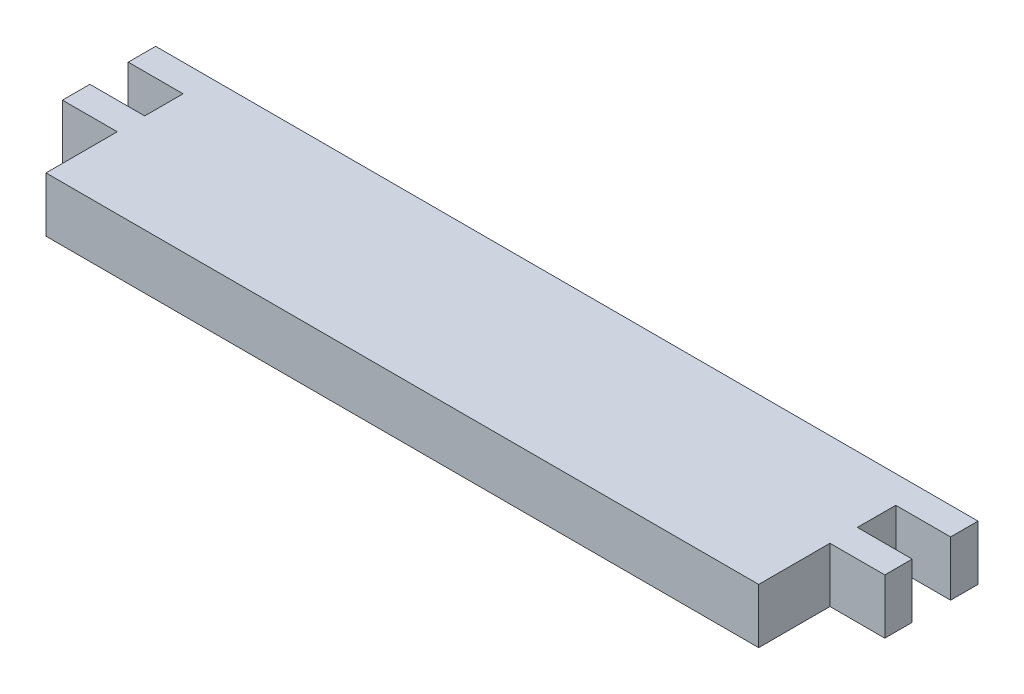
ISO-10303-21;
HEADER;
FILE_DESCRIPTION(('STEP AP214'),'2;1');
FILE_NAME('part.step','',(''),(''),'','','');
FILE_SCHEMA(('AUTOMOTIVE_DESIGN { 1 0 10303 214 1 1 1 1 }'));
ENDSEC;
DATA;
#1=APPLICATION_CONTEXT('core data for automotive mechanical design processes');
#2=APPLICATION_PROTOCOL_DEFINITION('international standard','automotive_design',2000,#1);
#3=PRODUCT_CONTEXT('',#1,'mechanical');
#4=PRODUCT('Part','Part','',(#3));
#5=PRODUCT_RELATED_PRODUCT_CATEGORY('part','',(#4));
#6=PRODUCT_DEFINITION_FORMATION('','',#4);
#7=PRODUCT_DEFINITION_CONTEXT('part definition',#1,'design');
#8=PRODUCT_DEFINITION('design','',#6,#7);
#9=PRODUCT_DEFINITION_SHAPE('','',#8);
#10=(LENGTH_UNIT() NAMED_UNIT(*) SI_UNIT(.MILLI.,.METRE.));
#11=(NAMED_UNIT(*) PLANE_ANGLE_UNIT() SI_UNIT($,.RADIAN.));
#12=(NAMED_UNIT(*) SI_UNIT($,.STERADIAN.) SOLID_ANGLE_UNIT());
#13=UNCERTAINTY_MEASURE_WITH_UNIT(LENGTH_MEASURE(1.E-05),#10,'distance_accuracy_value','');
#14=(GEOMETRIC_REPRESENTATION_CONTEXT(3) GLOBAL_UNCERTAINTY_ASSIGNED_CONTEXT((#13)) GLOBAL_UNIT_ASSIGNED_CONTEXT((#10,
#11,#12)) REPRESENTATION_CONTEXT('',''));
#15=CARTESIAN_POINT('',(0.,0.,0.));
#16=DIRECTION('',(0.,0.,1.));
#17=DIRECTION('',(1.,0.,0.));
#18=AXIS2_PLACEMENT_3D('',#15,#16,#17);
#19=CARTESIAN_POINT('',(65.,5.,7.));
#20=DIRECTION('',(-1.,0.,0.));
#21=DIRECTION('',(0.,0.,1.));
#22=AXIS2_PLACEMENT_3D('',#19,#20,#21);
#23=PLANE('',#22);
#24=DIRECTION('',(0.,0.,-1.));
#25=VECTOR('',#24,1.);
#26=CARTESIAN_POINT('',(65.,5.,7.));
#27=LINE('',#26,#25);
#28=CARTESIAN_POINT('',(65.,5.,7.));
#29=VERTEX_POINT('',#28);
#30=CARTESIAN_POINT('',(65.,5.,0.));
#31=VERTEX_POINT('',#30);
#32=EDGE_CURVE('E52',#29,#31,#27,.T.);
#33=ORIENTED_EDGE('',*,*,#32,.F.);
#34=DIRECTION('',(0.,-1.,0.));
#35=VECTOR('',#34,1.);
#36=CARTESIAN_POINT('',(65.,5.,7.));
#37=LINE('',#36,#35);
#38=CARTESIAN_POINT('',(65.,-5.,7.));
#39=VERTEX_POINT('',#38);
#40=EDGE_CURVE('E59',#29,#39,#37,.T.);
#41=ORIENTED_EDGE('',*,*,#40,.T.);
#42=DIRECTION('',(0.,0.,-1.));
#43=VECTOR('',#42,1.);
#44=CARTESIAN_POINT('',(65.,-5.,7.));
#45=LINE('',#44,#43);
#46=CARTESIAN_POINT('',(65.,-5.,0.));
#47=VERTEX_POINT('',#46);
#48=EDGE_CURVE('E439',#39,#47,#45,.T.);
#49=ORIENTED_EDGE('',*,*,#48,.T.);
#50=DIRECTION('',(0.,1.,0.));
#51=VECTOR('',#50,1.);
#52=CARTESIAN_POINT('',(65.,5.,0.));
#53=LINE('',#52,#51);
#54=EDGE_CURVE('E431',#47,#31,#53,.T.);
#55=ORIENTED_EDGE('',*,*,#54,.T.);
#56=EDGE_LOOP('',(#33,#41,#49,#55));
#57=FACE_BOUND('',#56,.T.);
#58=ADVANCED_FACE('F43',(#57),#23,.F.);
#59=CARTESIAN_POINT('',(-65.,5.,7.));
#60=DIRECTION('',(1.,0.,0.));
#61=DIRECTION('',(0.,0.,-1.));
#62=AXIS2_PLACEMENT_3D('',#59,#60,#61);
#63=PLANE('',#62);
#64=DIRECTION('',(0.,-1.,0.));
#65=VECTOR('',#64,1.);
#66=CARTESIAN_POINT('',(-65.,5.,7.));
#67=LINE('',#66,#65);
#68=CARTESIAN_POINT('',(-65.,5.,7.));
#69=VERTEX_POINT('',#68);
#70=CARTESIAN_POINT('',(-65.,-5.,7.));
#71=VERTEX_POINT('',#70);
#72=EDGE_CURVE('E212',#69,#71,#67,.T.);
#73=ORIENTED_EDGE('',*,*,#72,.F.);
#74=DIRECTION('',(0.,0.,-1.));
#75=VECTOR('',#74,1.);
#76=CARTESIAN_POINT('',(-65.,5.,7.));
#77=LINE('',#76,#75);
#78=CARTESIAN_POINT('',(-65.,5.,0.));
#79=VERTEX_POINT('',#78);
#80=EDGE_CURVE('E448',#69,#79,#77,.T.);
#81=ORIENTED_EDGE('',*,*,#80,.T.);
#82=DIRECTION('',(0.,-1.,0.));
#83=VECTOR('',#82,1.);
#84=CARTESIAN_POINT('',(-65.,5.,0.));
#85=LINE('',#84,#83);
#86=CARTESIAN_POINT('',(-65.,-5.,0.));
#87=VERTEX_POINT('',#86);
#88=EDGE_CURVE('E435',#79,#87,#85,.T.);
#89=ORIENTED_EDGE('',*,*,#88,.T.);
#90=DIRECTION('',(0.,0.,-1.));
#91=VECTOR('',#90,1.);
#92=CARTESIAN_POINT('',(-65.,-5.,7.));
#93=LINE('',#92,#91);
#94=EDGE_CURVE('E444',#71,#87,#93,.T.);
#95=ORIENTED_EDGE('',*,*,#94,.F.);
#96=EDGE_LOOP('',(#73,#81,#89,#95));
#97=FACE_BOUND('',#96,.T.);
#98=ADVANCED_FACE('F455',(#97),#63,.F.);
#99=DIRECTION('',(0.,1.,0.));
#100=VECTOR('',#99,1.);
#101=CARTESIAN_POINT('',(-65.,5.,12.));
#102=LINE('',#101,#100);
#103=CARTESIAN_POINT('',(-65.,-5.,12.));
#104=VERTEX_POINT('',#103);
#105=CARTESIAN_POINT('',(-65.,5.,12.));
#106=VERTEX_POINT('',#105);
#107=EDGE_CURVE('E253',#104,#106,#102,.T.);
#108=ORIENTED_EDGE('',*,*,#107,.F.);
#109=CARTESIAN_POINT('',(-65.,-5.,25.));
#110=VERTEX_POINT('',#109);
#111=EDGE_CURVE('E445',#110,#104,#93,.T.);
#112=ORIENTED_EDGE('',*,*,#111,.F.);
#113=DIRECTION('',(0.,-1.,0.));
#114=VECTOR('',#113,1.);
#115=CARTESIAN_POINT('',(-65.,5.,25.));
#116=LINE('',#115,#114);
#117=CARTESIAN_POINT('',(-65.,5.,25.));
#118=VERTEX_POINT('',#117);
#119=EDGE_CURVE('E328',#118,#110,#116,.T.);
#120=ORIENTED_EDGE('',*,*,#119,.F.);
#121=EDGE_CURVE('E67',#118,#106,#77,.T.);
#122=ORIENTED_EDGE('',*,*,#121,.T.);
#123=EDGE_LOOP('',(#108,#112,#120,#122));
#124=FACE_BOUND('',#123,.T.);
#125=ADVANCED_FACE('F493',(#124),#63,.F.);
#126=CARTESIAN_POINT('',(-65.,-5.,7.));
#127=DIRECTION('',(0.,1.,0.));
#128=DIRECTION('',(0.,0.,1.));
#129=AXIS2_PLACEMENT_3D('',#126,#127,#128);
#130=PLANE('',#129);
#131=DIRECTION('',(0.,0.,1.));
#132=VECTOR('',#131,1.);
#133=CARTESIAN_POINT('',(29.,-5.,22.));
#134=LINE('',#133,#132);
#135=CARTESIAN_POINT('',(29.,-5.,4.));
#136=VERTEX_POINT('',#135);
#137=CARTESIAN_POINT('',(29.,-5.,22.));
#138=VERTEX_POINT('',#137);
#139=EDGE_CURVE('E304',#136,#138,#134,.T.);
#140=ORIENTED_EDGE('',*,*,#139,.T.);
#141=DIRECTION('',(1.,0.,0.));
#142=VECTOR('',#141,1.);
#143=CARTESIAN_POINT('',(29.,-5.,22.));
#144=LINE('',#143,#142);
#145=CARTESIAN_POINT('',(59.,-5.,22.));
#146=VERTEX_POINT('',#145);
#147=EDGE_CURVE('E352',#138,#146,#144,.T.);
#148=ORIENTED_EDGE('',*,*,#147,.T.);
#149=DIRECTION('',(0.,0.,-1.));
#150=VECTOR('',#149,1.);
#151=CARTESIAN_POINT('',(59.,-5.,22.));
#152=LINE('',#151,#150);
#153=CARTESIAN_POINT('',(59.,-5.,4.));
#154=VERTEX_POINT('',#153);
#155=EDGE_CURVE('E347',#146,#154,#152,.T.);
#156=ORIENTED_EDGE('',*,*,#155,.T.);
#157=DIRECTION('',(-1.,0.,0.));
#158=VECTOR('',#157,1.);
#159=CARTESIAN_POINT('',(29.,-5.,4.));
#160=LINE('',#159,#158);
#161=EDGE_CURVE('E343',#154,#136,#160,.T.);
#162=ORIENTED_EDGE('',*,*,#161,.T.);
#163=EDGE_LOOP('',(#140,#148,#156,#162));
#164=FACE_BOUND('',#163,.T.);
#165=ORIENTED_EDGE('',*,*,#111,.T.);
#166=DIRECTION('',(1.,0.,0.));
#167=VECTOR('',#166,1.);
#168=CARTESIAN_POINT('',(-75.,-5.,12.));
#169=LINE('',#168,#167);
#170=CARTESIAN_POINT('',(-75.,-5.,12.));
#171=VERTEX_POINT('',#170);
#172=EDGE_CURVE('E275',#171,#104,#169,.T.);
#173=ORIENTED_EDGE('',*,*,#172,.F.);
#174=DIRECTION('',(0.,0.,1.));
#175=VECTOR('',#174,1.);
#176=CARTESIAN_POINT('',(-75.,-5.,7.));
#177=LINE('',#176,#175);
#178=CARTESIAN_POINT('',(-75.,-5.,7.));
#179=VERTEX_POINT('',#178);
#180=EDGE_CURVE('E252',#179,#171,#177,.T.);
#181=ORIENTED_EDGE('',*,*,#180,.F.);
#182=DIRECTION('',(1.,0.,0.));
#183=VECTOR('',#182,1.);
#184=CARTESIAN_POINT('',(-75.,-5.,7.));
#185=LINE('',#184,#183);
#186=EDGE_CURVE('E279',#179,#71,#185,.T.);
#187=ORIENTED_EDGE('',*,*,#186,.T.);
#188=ORIENTED_EDGE('',*,*,#94,.T.);
#189=DIRECTION('',(-1.,0.,0.));
#190=VECTOR('',#189,1.);
#191=CARTESIAN_POINT('',(75.,-5.,0.));
#192=LINE('',#191,#190);
#193=CARTESIAN_POINT('',(-75.,-5.,0.));
#194=VERTEX_POINT('',#193);
#195=EDGE_CURVE('E412',#87,#194,#192,.T.);
#196=ORIENTED_EDGE('',*,*,#195,.T.);
#197=DIRECTION('',(0.,0.,1.));
#198=VECTOR('',#197,1.);
#199=CARTESIAN_POINT('',(-75.,-5.,-5.));
#200=LINE('',#199,#198);
#201=CARTESIAN_POINT('',(-75.,-5.,-5.));
#202=VERTEX_POINT('',#201);
#203=EDGE_CURVE('E400',#202,#194,#200,.T.);
#204=ORIENTED_EDGE('',*,*,#203,.F.);
#205=DIRECTION('',(-1.,0.,0.));
#206=VECTOR('',#205,1.);
#207=CARTESIAN_POINT('',(75.,-5.,-5.));
#208=LINE('',#207,#206);
#209=CARTESIAN_POINT('',(75.,-5.,-5.));
#210=VERTEX_POINT('',#209);
#211=EDGE_CURVE('E397',#210,#202,#208,.T.);
#212=ORIENTED_EDGE('',*,*,#211,.F.);
#213=DIRECTION('',(0.,0.,1.));
#214=VECTOR('',#213,1.);
#215=CARTESIAN_POINT('',(75.,-5.,-5.));
#216=LINE('',#215,#214);
#217=CARTESIAN_POINT('',(75.,-5.,0.));
#218=VERTEX_POINT('',#217);
#219=EDGE_CURVE('E419',#210,#218,#216,.T.);
#220=ORIENTED_EDGE('',*,*,#219,.T.);
#221=EDGE_CURVE('E391',#218,#47,#192,.T.);
#222=ORIENTED_EDGE('',*,*,#221,.T.);
#223=ORIENTED_EDGE('',*,*,#48,.F.);
#224=DIRECTION('',(-1.,0.,0.));
#225=VECTOR('',#224,1.);
#226=CARTESIAN_POINT('',(75.,-5.,7.));
#227=LINE('',#226,#225);
#228=CARTESIAN_POINT('',(75.,-5.,7.));
#229=VERTEX_POINT('',#228);
#230=EDGE_CURVE('E235',#229,#39,#227,.T.);
#231=ORIENTED_EDGE('',*,*,#230,.F.);
#232=DIRECTION('',(0.,0.,1.));
#233=VECTOR('',#232,1.);
#234=CARTESIAN_POINT('',(75.,-5.,7.));
#235=LINE('',#234,#233);
#236=CARTESIAN_POINT('',(75.,-5.,12.));
#237=VERTEX_POINT('',#236);
#238=EDGE_CURVE('E222',#229,#237,#235,.T.);
#239=ORIENTED_EDGE('',*,*,#238,.T.);
#240=DIRECTION('',(-1.,0.,0.));
#241=VECTOR('',#240,1.);
#242=CARTESIAN_POINT('',(75.,-5.,12.));
#243=LINE('',#242,#241);
#244=CARTESIAN_POINT('',(65.,-5.,12.));
#245=VERTEX_POINT('',#244);
#246=EDGE_CURVE('E243',#237,#245,#243,.T.);
#247=ORIENTED_EDGE('',*,*,#246,.T.);
#248=CARTESIAN_POINT('',(65.,-5.,25.));
#249=VERTEX_POINT('',#248);
#250=EDGE_CURVE('E440',#249,#245,#45,.T.);
#251=ORIENTED_EDGE('',*,*,#250,.F.);
#252=DIRECTION('',(1.,0.,0.));
#253=VECTOR('',#252,1.);
#254=CARTESIAN_POINT('',(-65.,-5.,25.));
#255=LINE('',#254,#253);
#256=EDGE_CURVE('E373',#110,#249,#255,.T.);
#257=ORIENTED_EDGE('',*,*,#256,.F.);
#258=EDGE_LOOP('',(#165,#173,#181,#187,#188,#196,#204,#212,#220,#222,#223,#231,#239,#247,#251,#257));
#259=FACE_BOUND('',#258,.T.);
#260=DIRECTION('',(0.,0.,1.));
#261=VECTOR('',#260,1.);
#262=CARTESIAN_POINT('',(-59.,-5.,22.));
#263=LINE('',#262,#261);
#264=CARTESIAN_POINT('',(-59.,-5.,4.));
#265=VERTEX_POINT('',#264);
#266=CARTESIAN_POINT('',(-59.,-5.,22.));
#267=VERTEX_POINT('',#266);
#268=EDGE_CURVE('E299',#265,#267,#263,.T.);
#269=ORIENTED_EDGE('',*,*,#268,.T.);
#270=DIRECTION('',(1.,0.,0.));
#271=VECTOR('',#270,1.);
#272=CARTESIAN_POINT('',(-59.,-5.,22.));
#273=LINE('',#272,#271);
#274=CARTESIAN_POINT('',(-29.,-5.,22.));
#275=VERTEX_POINT('',#274);
#276=EDGE_CURVE('E303',#267,#275,#273,.T.);
#277=ORIENTED_EDGE('',*,*,#276,.T.);
#278=DIRECTION('',(0.,0.,-1.));
#279=VECTOR('',#278,1.);
#280=CARTESIAN_POINT('',(-29.,-5.,22.));
#281=LINE('',#280,#279);
#282=CARTESIAN_POINT('',(-29.,-5.,4.));
#283=VERTEX_POINT('',#282);
#284=EDGE_CURVE('E308',#275,#283,#281,.T.);
#285=ORIENTED_EDGE('',*,*,#284,.T.);
#286=DIRECTION('',(-1.,0.,0.));
#287=VECTOR('',#286,1.);
#288=CARTESIAN_POINT('',(-59.,-5.,4.));
#289=LINE('',#288,#287);
#290=EDGE_CURVE('E289',#283,#265,#289,.T.);
#291=ORIENTED_EDGE('',*,*,#290,.T.);
#292=EDGE_LOOP('',(#269,#277,#285,#291));
#293=FACE_BOUND('',#292,.T.);
#294=ADVANCED_FACE('F469',(#164,#259,#293),#130,.F.);
#295=ORIENTED_EDGE('',*,*,#250,.T.);
#296=DIRECTION('',(0.,1.,0.));
#297=VECTOR('',#296,1.);
#298=CARTESIAN_POINT('',(65.,5.,12.));
#299=LINE('',#298,#297);
#300=CARTESIAN_POINT('',(65.,5.,12.));
#301=VERTEX_POINT('',#300);
#302=EDGE_CURVE('E224',#245,#301,#299,.T.);
#303=ORIENTED_EDGE('',*,*,#302,.T.);
#304=CARTESIAN_POINT('',(65.,5.,25.));
#305=VERTEX_POINT('',#304);
#306=EDGE_CURVE('E11',#305,#301,#27,.T.);
#307=ORIENTED_EDGE('',*,*,#306,.F.);
#308=DIRECTION('',(0.,1.,0.));
#309=VECTOR('',#308,1.);
#310=CARTESIAN_POINT('',(65.,5.,25.));
#311=LINE('',#310,#309);
#312=EDGE_CURVE('E377',#249,#305,#311,.T.);
#313=ORIENTED_EDGE('',*,*,#312,.F.);
#314=EDGE_LOOP('',(#295,#303,#307,#313));
#315=FACE_BOUND('',#314,.T.);
#316=ADVANCED_FACE('F45',(#315),#23,.F.);
#317=CARTESIAN_POINT('',(-65.,5.,7.));
#318=DIRECTION('',(0.,-1.,0.));
#319=DIRECTION('',(0.,0.,-1.));
#320=AXIS2_PLACEMENT_3D('',#317,#318,#319);
#321=PLANE('',#320);
#322=ORIENTED_EDGE('',*,*,#306,.T.);
#323=DIRECTION('',(-1.,0.,0.));
#324=VECTOR('',#323,1.);
#325=CARTESIAN_POINT('',(75.,5.,12.));
#326=LINE('',#325,#324);
#327=CARTESIAN_POINT('',(75.,5.,12.));
#328=VERTEX_POINT('',#327);
#329=EDGE_CURVE('E213',#328,#301,#326,.T.);
#330=ORIENTED_EDGE('',*,*,#329,.F.);
#331=DIRECTION('',(0.,0.,-1.));
#332=VECTOR('',#331,1.);
#333=CARTESIAN_POINT('',(75.,5.,7.));
#334=LINE('',#333,#332);
#335=CARTESIAN_POINT('',(75.,5.,7.));
#336=VERTEX_POINT('',#335);
#337=EDGE_CURVE('E219',#328,#336,#334,.T.);
#338=ORIENTED_EDGE('',*,*,#337,.T.);
#339=DIRECTION('',(-1.,0.,0.));
#340=VECTOR('',#339,1.);
#341=CARTESIAN_POINT('',(75.,5.,7.));
#342=LINE('',#341,#340);
#343=EDGE_CURVE('E203',#336,#29,#342,.T.);
#344=ORIENTED_EDGE('',*,*,#343,.T.);
#345=ORIENTED_EDGE('',*,*,#32,.T.);
#346=DIRECTION('',(1.,0.,0.));
#347=VECTOR('',#346,1.);
#348=CARTESIAN_POINT('',(75.,5.,0.));
#349=LINE('',#348,#347);
#350=CARTESIAN_POINT('',(75.,5.,0.));
#351=VERTEX_POINT('',#350);
#352=EDGE_CURVE('E404',#31,#351,#349,.T.);
#353=ORIENTED_EDGE('',*,*,#352,.T.);
#354=DIRECTION('',(0.,0.,1.));
#355=VECTOR('',#354,1.);
#356=CARTESIAN_POINT('',(75.,5.,-5.));
#357=LINE('',#356,#355);
#358=CARTESIAN_POINT('',(75.,5.,-5.));
#359=VERTEX_POINT('',#358);
#360=EDGE_CURVE('E423',#359,#351,#357,.T.);
#361=ORIENTED_EDGE('',*,*,#360,.F.);
#362=DIRECTION('',(1.,0.,0.));
#363=VECTOR('',#362,1.);
#364=CARTESIAN_POINT('',(75.,5.,-5.));
#365=LINE('',#364,#363);
#366=CARTESIAN_POINT('',(-75.,5.,-5.));
#367=VERTEX_POINT('',#366);
#368=EDGE_CURVE('E390',#367,#359,#365,.T.);
#369=ORIENTED_EDGE('',*,*,#368,.F.);
#370=DIRECTION('',(0.,0.,1.));
#371=VECTOR('',#370,1.);
#372=CARTESIAN_POINT('',(-75.,5.,-5.));
#373=LINE('',#372,#371);
#374=CARTESIAN_POINT('',(-75.,5.,0.));
#375=VERTEX_POINT('',#374);
#376=EDGE_CURVE('E427',#367,#375,#373,.T.);
#377=ORIENTED_EDGE('',*,*,#376,.T.);
#378=EDGE_CURVE('E405',#375,#79,#349,.T.);
#379=ORIENTED_EDGE('',*,*,#378,.T.);
#380=ORIENTED_EDGE('',*,*,#80,.F.);
#381=DIRECTION('',(1.,0.,0.));
#382=VECTOR('',#381,1.);
#383=CARTESIAN_POINT('',(-75.,5.,7.));
#384=LINE('',#383,#382);
#385=CARTESIAN_POINT('',(-75.,5.,7.));
#386=VERTEX_POINT('',#385);
#387=EDGE_CURVE('E262',#386,#69,#384,.T.);
#388=ORIENTED_EDGE('',*,*,#387,.F.);
#389=DIRECTION('',(0.,0.,-1.));
#390=VECTOR('',#389,1.);
#391=CARTESIAN_POINT('',(-75.,5.,7.));
#392=LINE('',#391,#390);
#393=CARTESIAN_POINT('',(-75.,5.,12.));
#394=VERTEX_POINT('',#393);
#395=EDGE_CURVE('E259',#394,#386,#392,.T.);
#396=ORIENTED_EDGE('',*,*,#395,.F.);
#397=DIRECTION('',(1.,0.,0.));
#398=VECTOR('',#397,1.);
#399=CARTESIAN_POINT('',(-75.,5.,12.));
#400=LINE('',#399,#398);
#401=EDGE_CURVE('E271',#394,#106,#400,.T.);
#402=ORIENTED_EDGE('',*,*,#401,.T.);
#403=ORIENTED_EDGE('',*,*,#121,.F.);
#404=DIRECTION('',(-1.,0.,0.));
#405=VECTOR('',#404,1.);
#406=CARTESIAN_POINT('',(-65.,5.,25.));
#407=LINE('',#406,#405);
#408=EDGE_CURVE('E381',#305,#118,#407,.T.);
#409=ORIENTED_EDGE('',*,*,#408,.F.);
#410=EDGE_LOOP('',(#322,#330,#338,#344,#345,#353,#361,#369,#377,#379,#380,#388,#396,#402,#403,#409));
#411=FACE_BOUND('',#410,.T.);
#412=ADVANCED_FACE('F226',(#411),#321,.F.);
#413=CARTESIAN_POINT('',(0.,0.,0.));
#414=DIRECTION('',(0.,0.,-1.));
#415=DIRECTION('',(-1.,0.,0.));
#416=AXIS2_PLACEMENT_3D('',#413,#414,#415);
#417=PLANE('',#416);
#418=ORIENTED_EDGE('',*,*,#54,.F.);
#419=ORIENTED_EDGE('',*,*,#221,.F.);
#420=DIRECTION('',(0.,-1.,0.));
#421=VECTOR('',#420,1.);
#422=CARTESIAN_POINT('',(75.,5.,0.));
#423=LINE('',#422,#421);
#424=EDGE_CURVE('E409',#351,#218,#423,.T.);
#425=ORIENTED_EDGE('',*,*,#424,.F.);
#426=ORIENTED_EDGE('',*,*,#352,.F.);
#427=EDGE_LOOP('',(#418,#419,#425,#426));
#428=FACE_BOUND('',#427,.T.);
#429=ADVANCED_FACE('F482',(#428),#417,.F.);
#430=CARTESIAN_POINT('',(-75.,5.,-5.));
#431=DIRECTION('',(1.,0.,0.));
#432=DIRECTION('',(0.,0.,-1.));
#433=AXIS2_PLACEMENT_3D('',#430,#431,#432);
#434=PLANE('',#433);
#435=DIRECTION('',(0.,1.,0.));
#436=VECTOR('',#435,1.);
#437=CARTESIAN_POINT('',(-75.,5.,0.));
#438=LINE('',#437,#436);
#439=EDGE_CURVE('E385',#194,#375,#438,.T.);
#440=ORIENTED_EDGE('',*,*,#439,.T.);
#441=ORIENTED_EDGE('',*,*,#376,.F.);
#442=DIRECTION('',(0.,1.,0.));
#443=VECTOR('',#442,1.);
#444=CARTESIAN_POINT('',(-75.,5.,-5.));
#445=LINE('',#444,#443);
#446=EDGE_CURVE('E386',#202,#367,#445,.T.);
#447=ORIENTED_EDGE('',*,*,#446,.F.);
#448=ORIENTED_EDGE('',*,*,#203,.T.);
#449=EDGE_LOOP('',(#440,#441,#447,#448));
#450=FACE_BOUND('',#449,.T.);
#451=ADVANCED_FACE('F465',(#450),#434,.F.);
#452=CARTESIAN_POINT('',(75.,5.,-5.));
#453=DIRECTION('',(-1.,0.,0.));
#454=DIRECTION('',(0.,0.,1.));
#455=AXIS2_PLACEMENT_3D('',#452,#453,#454);
#456=PLANE('',#455);
#457=ORIENTED_EDGE('',*,*,#424,.T.);
#458=ORIENTED_EDGE('',*,*,#219,.F.);
#459=DIRECTION('',(0.,-1.,0.));
#460=VECTOR('',#459,1.);
#461=CARTESIAN_POINT('',(75.,5.,-5.));
#462=LINE('',#461,#460);
#463=EDGE_CURVE('E394',#359,#210,#462,.T.);
#464=ORIENTED_EDGE('',*,*,#463,.F.);
#465=ORIENTED_EDGE('',*,*,#360,.T.);
#466=EDGE_LOOP('',(#457,#458,#464,#465));
#467=FACE_BOUND('',#466,.T.);
#468=ADVANCED_FACE('F479',(#467),#456,.F.);
#469=CARTESIAN_POINT('',(0.,0.,-5.));
#470=DIRECTION('',(0.,0.,-1.));
#471=DIRECTION('',(-1.,0.,0.));
#472=AXIS2_PLACEMENT_3D('',#469,#470,#471);
#473=PLANE('',#472);
#474=ORIENTED_EDGE('',*,*,#446,.T.);
#475=ORIENTED_EDGE('',*,*,#368,.T.);
#476=ORIENTED_EDGE('',*,*,#463,.T.);
#477=ORIENTED_EDGE('',*,*,#211,.T.);
#478=EDGE_LOOP('',(#474,#475,#476,#477));
#479=FACE_BOUND('',#478,.T.);
#480=ADVANCED_FACE('F572',(#479),#473,.T.);
#481=ORIENTED_EDGE('',*,*,#88,.F.);
#482=ORIENTED_EDGE('',*,*,#378,.F.);
#483=ORIENTED_EDGE('',*,*,#439,.F.);
#484=ORIENTED_EDGE('',*,*,#195,.F.);
#485=EDGE_LOOP('',(#481,#482,#483,#484));
#486=FACE_BOUND('',#485,.T.);
#487=ADVANCED_FACE('F459',(#486),#417,.F.);
#488=CARTESIAN_POINT('',(0.,0.,25.));
#489=DIRECTION('',(0.,0.,1.));
#490=DIRECTION('',(1.,0.,0.));
#491=AXIS2_PLACEMENT_3D('',#488,#489,#490);
#492=PLANE('',#491);
#493=ORIENTED_EDGE('',*,*,#119,.T.);
#494=ORIENTED_EDGE('',*,*,#256,.T.);
#495=ORIENTED_EDGE('',*,*,#312,.T.);
#496=ORIENTED_EDGE('',*,*,#408,.T.);
#497=EDGE_LOOP('',(#493,#494,#495,#496));
#498=FACE_BOUND('',#497,.T.);
#499=ADVANCED_FACE('F508',(#498),#492,.T.);
#500=CARTESIAN_POINT('',(29.,-1.,22.));
#501=DIRECTION('',(1.,0.,0.));
#502=DIRECTION('',(0.,0.,-1.));
#503=AXIS2_PLACEMENT_3D('',#500,#501,#502);
#504=PLANE('',#503);
#505=ORIENTED_EDGE('',*,*,#139,.F.);
#506=DIRECTION('',(0.,-1.,0.));
#507=VECTOR('',#506,1.);
#508=CARTESIAN_POINT('',(29.,-1.,4.));
#509=LINE('',#508,#507);
#510=CARTESIAN_POINT('',(29.,-1.,4.));
#511=VERTEX_POINT('',#510);
#512=EDGE_CURVE('E338',#511,#136,#509,.T.);
#513=ORIENTED_EDGE('',*,*,#512,.F.);
#514=DIRECTION('',(0.,0.,1.));
#515=VECTOR('',#514,1.);
#516=CARTESIAN_POINT('',(29.,-1.,22.));
#517=LINE('',#516,#515);
#518=CARTESIAN_POINT('',(29.,-1.,22.));
#519=VERTEX_POINT('',#518);
#520=EDGE_CURVE('E348',#511,#519,#517,.T.);
#521=ORIENTED_EDGE('',*,*,#520,.T.);
#522=DIRECTION('',(0.,-1.,0.));
#523=VECTOR('',#522,1.);
#524=CARTESIAN_POINT('',(29.,-1.,22.));
#525=LINE('',#524,#523);
#526=EDGE_CURVE('E283',#519,#138,#525,.T.);
#527=ORIENTED_EDGE('',*,*,#526,.T.);
#528=EDGE_LOOP('',(#505,#513,#521,#527));
#529=FACE_BOUND('',#528,.T.);
#530=ADVANCED_FACE('F551',(#529),#504,.T.);
#531=CARTESIAN_POINT('',(29.,-1.,22.));
#532=DIRECTION('',(0.,0.,-1.));
#533=DIRECTION('',(-1.,0.,0.));
#534=AXIS2_PLACEMENT_3D('',#531,#532,#533);
#535=PLANE('',#534);
#536=ORIENTED_EDGE('',*,*,#147,.F.);
#537=ORIENTED_EDGE('',*,*,#526,.F.);
#538=DIRECTION('',(1.,0.,0.));
#539=VECTOR('',#538,1.);
#540=CARTESIAN_POINT('',(29.,-1.,22.));
#541=LINE('',#540,#539);
#542=CARTESIAN_POINT('',(59.,-1.,22.));
#543=VERTEX_POINT('',#542);
#544=EDGE_CURVE('E364',#519,#543,#541,.T.);
#545=ORIENTED_EDGE('',*,*,#544,.T.);
#546=DIRECTION('',(0.,-1.,0.));
#547=VECTOR('',#546,1.);
#548=CARTESIAN_POINT('',(59.,-1.,22.));
#549=LINE('',#548,#547);
#550=EDGE_CURVE('E332',#543,#146,#549,.T.);
#551=ORIENTED_EDGE('',*,*,#550,.T.);
#552=EDGE_LOOP('',(#536,#537,#545,#551));
#553=FACE_BOUND('',#552,.T.);
#554=ADVANCED_FACE('F554',(#553),#535,.T.);
#555=CARTESIAN_POINT('',(59.,-1.,22.));
#556=DIRECTION('',(-1.,0.,0.));
#557=DIRECTION('',(0.,0.,1.));
#558=AXIS2_PLACEMENT_3D('',#555,#556,#557);
#559=PLANE('',#558);
#560=ORIENTED_EDGE('',*,*,#155,.F.);
#561=ORIENTED_EDGE('',*,*,#550,.F.);
#562=DIRECTION('',(0.,0.,-1.));
#563=VECTOR('',#562,1.);
#564=CARTESIAN_POINT('',(59.,-1.,22.));
#565=LINE('',#564,#563);
#566=CARTESIAN_POINT('',(59.,-1.,4.));
#567=VERTEX_POINT('',#566);
#568=EDGE_CURVE('E361',#543,#567,#565,.T.);
#569=ORIENTED_EDGE('',*,*,#568,.T.);
#570=DIRECTION('',(0.,-1.,0.));
#571=VECTOR('',#570,1.);
#572=CARTESIAN_POINT('',(59.,-1.,4.));
#573=LINE('',#572,#571);
#574=EDGE_CURVE('E335',#567,#154,#573,.T.);
#575=ORIENTED_EDGE('',*,*,#574,.T.);
#576=EDGE_LOOP('',(#560,#561,#569,#575));
#577=FACE_BOUND('',#576,.T.);
#578=ADVANCED_FACE('F558',(#577),#559,.T.);
#579=CARTESIAN_POINT('',(29.,-1.,4.));
#580=DIRECTION('',(0.,0.,1.));
#581=DIRECTION('',(1.,0.,0.));
#582=AXIS2_PLACEMENT_3D('',#579,#580,#581);
#583=PLANE('',#582);
#584=ORIENTED_EDGE('',*,*,#161,.F.);
#585=ORIENTED_EDGE('',*,*,#574,.F.);
#586=DIRECTION('',(-1.,0.,0.));
#587=VECTOR('',#586,1.);
#588=CARTESIAN_POINT('',(29.,-1.,4.));
#589=LINE('',#588,#587);
#590=EDGE_CURVE('E342',#567,#511,#589,.T.);
#591=ORIENTED_EDGE('',*,*,#590,.T.);
#592=ORIENTED_EDGE('',*,*,#512,.T.);
#593=EDGE_LOOP('',(#584,#585,#591,#592));
#594=FACE_BOUND('',#593,.T.);
#595=ADVANCED_FACE('F562',(#594),#583,.T.);
#596=CARTESIAN_POINT('',(0.,-1.,0.));
#597=DIRECTION('',(0.,-1.,0.));
#598=DIRECTION('',(0.,0.,-1.));
#599=AXIS2_PLACEMENT_3D('',#596,#597,#598);
#600=PLANE('',#599);
#601=ORIENTED_EDGE('',*,*,#520,.F.);
#602=ORIENTED_EDGE('',*,*,#590,.F.);
#603=ORIENTED_EDGE('',*,*,#568,.F.);
#604=ORIENTED_EDGE('',*,*,#544,.F.);
#605=EDGE_LOOP('',(#601,#602,#603,#604));
#606=FACE_BOUND('',#605,.T.);
#607=ADVANCED_FACE('F549',(#606),#600,.T.);
#608=CARTESIAN_POINT('',(-59.,-1.,22.));
#609=DIRECTION('',(1.,0.,0.));
#610=DIRECTION('',(0.,0.,-1.));
#611=AXIS2_PLACEMENT_3D('',#608,#609,#610);
#612=PLANE('',#611);
#613=ORIENTED_EDGE('',*,*,#268,.F.);
#614=DIRECTION('',(0.,-1.,0.));
#615=VECTOR('',#614,1.);
#616=CARTESIAN_POINT('',(-59.,-1.,4.));
#617=LINE('',#616,#615);
#618=CARTESIAN_POINT('',(-59.,-1.,4.));
#619=VERTEX_POINT('',#618);
#620=EDGE_CURVE('E298',#619,#265,#617,.T.);
#621=ORIENTED_EDGE('',*,*,#620,.F.);
#622=DIRECTION('',(0.,0.,1.));
#623=VECTOR('',#622,1.);
#624=CARTESIAN_POINT('',(-59.,-1.,22.));
#625=LINE('',#624,#623);
#626=CARTESIAN_POINT('',(-59.,-1.,22.));
#627=VERTEX_POINT('',#626);
#628=EDGE_CURVE('E284',#619,#627,#625,.T.);
#629=ORIENTED_EDGE('',*,*,#628,.T.);
#630=DIRECTION('',(0.,-1.,0.));
#631=VECTOR('',#630,1.);
#632=CARTESIAN_POINT('',(-59.,-1.,22.));
#633=LINE('',#632,#631);
#634=EDGE_CURVE('E324',#627,#267,#633,.T.);
#635=ORIENTED_EDGE('',*,*,#634,.T.);
#636=EDGE_LOOP('',(#613,#621,#629,#635));
#637=FACE_BOUND('',#636,.T.);
#638=ADVANCED_FACE('F545',(#637),#612,.T.);
#639=CARTESIAN_POINT('',(-59.,-1.,22.));
#640=DIRECTION('',(0.,0.,-1.));
#641=DIRECTION('',(-1.,0.,0.));
#642=AXIS2_PLACEMENT_3D('',#639,#640,#641);
#643=PLANE('',#642);
#644=ORIENTED_EDGE('',*,*,#276,.F.);
#645=ORIENTED_EDGE('',*,*,#634,.F.);
#646=DIRECTION('',(1.,0.,0.));
#647=VECTOR('',#646,1.);
#648=CARTESIAN_POINT('',(-59.,-1.,22.));
#649=LINE('',#648,#647);
#650=CARTESIAN_POINT('',(-29.,-1.,22.));
#651=VERTEX_POINT('',#650);
#652=EDGE_CURVE('E288',#627,#651,#649,.T.);
#653=ORIENTED_EDGE('',*,*,#652,.T.);
#654=DIRECTION('',(0.,-1.,0.));
#655=VECTOR('',#654,1.);
#656=CARTESIAN_POINT('',(-29.,-1.,22.));
#657=LINE('',#656,#655);
#658=EDGE_CURVE('E321',#651,#275,#657,.T.);
#659=ORIENTED_EDGE('',*,*,#658,.T.);
#660=EDGE_LOOP('',(#644,#645,#653,#659));
#661=FACE_BOUND('',#660,.T.);
#662=ADVANCED_FACE('F541',(#661),#643,.T.);
#663=CARTESIAN_POINT('',(-29.,-1.,22.));
#664=DIRECTION('',(-1.,0.,0.));
#665=DIRECTION('',(0.,0.,1.));
#666=AXIS2_PLACEMENT_3D('',#663,#664,#665);
#667=PLANE('',#666);
#668=ORIENTED_EDGE('',*,*,#284,.F.);
#669=ORIENTED_EDGE('',*,*,#658,.F.);
#670=DIRECTION('',(0.,0.,-1.));
#671=VECTOR('',#670,1.);
#672=CARTESIAN_POINT('',(-29.,-1.,22.));
#673=LINE('',#672,#671);
#674=CARTESIAN_POINT('',(-29.,-1.,4.));
#675=VERTEX_POINT('',#674);
#676=EDGE_CURVE('E292',#651,#675,#673,.T.);
#677=ORIENTED_EDGE('',*,*,#676,.T.);
#678=DIRECTION('',(0.,-1.,0.));
#679=VECTOR('',#678,1.);
#680=CARTESIAN_POINT('',(-29.,-1.,4.));
#681=LINE('',#680,#679);
#682=EDGE_CURVE('E318',#675,#283,#681,.T.);
#683=ORIENTED_EDGE('',*,*,#682,.T.);
#684=EDGE_LOOP('',(#668,#669,#677,#683));
#685=FACE_BOUND('',#684,.T.);
#686=ADVANCED_FACE('F537',(#685),#667,.T.);
#687=CARTESIAN_POINT('',(-59.,-1.,4.));
#688=DIRECTION('',(0.,0.,1.));
#689=DIRECTION('',(1.,0.,0.));
#690=AXIS2_PLACEMENT_3D('',#687,#688,#689);
#691=PLANE('',#690);
#692=ORIENTED_EDGE('',*,*,#290,.F.);
#693=ORIENTED_EDGE('',*,*,#682,.F.);
#694=DIRECTION('',(-1.,0.,0.));
#695=VECTOR('',#694,1.);
#696=CARTESIAN_POINT('',(-59.,-1.,4.));
#697=LINE('',#696,#695);
#698=EDGE_CURVE('E295',#675,#619,#697,.T.);
#699=ORIENTED_EDGE('',*,*,#698,.T.);
#700=ORIENTED_EDGE('',*,*,#620,.T.);
#701=EDGE_LOOP('',(#692,#693,#699,#700));
#702=FACE_BOUND('',#701,.T.);
#703=ADVANCED_FACE('F530',(#702),#691,.T.);
#704=CARTESIAN_POINT('',(0.,-1.,0.));
#705=DIRECTION('',(0.,-1.,0.));
#706=DIRECTION('',(0.,0.,-1.));
#707=AXIS2_PLACEMENT_3D('',#704,#705,#706);
#708=PLANE('',#707);
#709=ORIENTED_EDGE('',*,*,#628,.F.);
#710=ORIENTED_EDGE('',*,*,#698,.F.);
#711=ORIENTED_EDGE('',*,*,#676,.F.);
#712=ORIENTED_EDGE('',*,*,#652,.F.);
#713=EDGE_LOOP('',(#709,#710,#711,#712));
#714=FACE_BOUND('',#713,.T.);
#715=ADVANCED_FACE('F523',(#714),#708,.T.);
#716=CARTESIAN_POINT('',(-75.,5.,7.));
#717=DIRECTION('',(0.,0.,1.));
#718=DIRECTION('',(0.,-1.,0.));
#719=AXIS2_PLACEMENT_3D('',#716,#717,#718);
#720=PLANE('',#719);
#721=ORIENTED_EDGE('',*,*,#72,.T.);
#722=ORIENTED_EDGE('',*,*,#186,.F.);
#723=DIRECTION('',(0.,-1.,0.));
#724=VECTOR('',#723,1.);
#725=CARTESIAN_POINT('',(-75.,5.,7.));
#726=LINE('',#725,#724);
#727=EDGE_CURVE('E248',#386,#179,#726,.T.);
#728=ORIENTED_EDGE('',*,*,#727,.F.);
#729=ORIENTED_EDGE('',*,*,#387,.T.);
#730=EDGE_LOOP('',(#721,#722,#728,#729));
#731=FACE_BOUND('',#730,.T.);
#732=ADVANCED_FACE('F521',(#731),#720,.F.);
#733=CARTESIAN_POINT('',(-75.,5.,12.));
#734=DIRECTION('',(0.,0.,-1.));
#735=DIRECTION('',(0.,1.,0.));
#736=AXIS2_PLACEMENT_3D('',#733,#734,#735);
#737=PLANE('',#736);
#738=ORIENTED_EDGE('',*,*,#107,.T.);
#739=ORIENTED_EDGE('',*,*,#401,.F.);
#740=DIRECTION('',(0.,1.,0.));
#741=VECTOR('',#740,1.);
#742=CARTESIAN_POINT('',(-75.,5.,12.));
#743=LINE('',#742,#741);
#744=EDGE_CURVE('E256',#171,#394,#743,.T.);
#745=ORIENTED_EDGE('',*,*,#744,.F.);
#746=ORIENTED_EDGE('',*,*,#172,.T.);
#747=EDGE_LOOP('',(#738,#739,#745,#746));
#748=FACE_BOUND('',#747,.T.);
#749=ADVANCED_FACE('F513',(#748),#737,.F.);
#750=CARTESIAN_POINT('',(-75.,0.,0.));
#751=DIRECTION('',(-1.,0.,0.));
#752=DIRECTION('',(0.,0.,1.));
#753=AXIS2_PLACEMENT_3D('',#750,#751,#752);
#754=PLANE('',#753);
#755=ORIENTED_EDGE('',*,*,#727,.T.);
#756=ORIENTED_EDGE('',*,*,#180,.T.);
#757=ORIENTED_EDGE('',*,*,#744,.T.);
#758=ORIENTED_EDGE('',*,*,#395,.T.);
#759=EDGE_LOOP('',(#755,#756,#757,#758));
#760=FACE_BOUND('',#759,.T.);
#761=ADVANCED_FACE('F517',(#760),#754,.T.);
#762=CARTESIAN_POINT('',(75.,5.,7.));
#763=DIRECTION('',(0.,0.,-1.));
#764=DIRECTION('',(0.,1.,0.));
#765=AXIS2_PLACEMENT_3D('',#762,#763,#764);
#766=PLANE('',#765);
#767=ORIENTED_EDGE('',*,*,#40,.F.);
#768=ORIENTED_EDGE('',*,*,#343,.F.);
#769=DIRECTION('',(0.,-1.,0.));
#770=VECTOR('',#769,1.);
#771=CARTESIAN_POINT('',(75.,5.,7.));
#772=LINE('',#771,#770);
#773=EDGE_CURVE('E206',#336,#229,#772,.T.);
#774=ORIENTED_EDGE('',*,*,#773,.T.);
#775=ORIENTED_EDGE('',*,*,#230,.T.);
#776=EDGE_LOOP('',(#767,#768,#774,#775));
#777=FACE_BOUND('',#776,.T.);
#778=ADVANCED_FACE('F205',(#777),#766,.T.);
#779=CARTESIAN_POINT('',(75.,5.,12.));
#780=DIRECTION('',(0.,0.,1.));
#781=DIRECTION('',(0.,-1.,0.));
#782=AXIS2_PLACEMENT_3D('',#779,#780,#781);
#783=PLANE('',#782);
#784=ORIENTED_EDGE('',*,*,#302,.F.);
#785=ORIENTED_EDGE('',*,*,#246,.F.);
#786=DIRECTION('',(0.,1.,0.));
#787=VECTOR('',#786,1.);
#788=CARTESIAN_POINT('',(75.,5.,12.));
#789=LINE('',#788,#787);
#790=EDGE_CURVE('E228',#237,#328,#789,.T.);
#791=ORIENTED_EDGE('',*,*,#790,.T.);
#792=ORIENTED_EDGE('',*,*,#329,.T.);
#793=EDGE_LOOP('',(#784,#785,#791,#792));
#794=FACE_BOUND('',#793,.T.);
#795=ADVANCED_FACE('F735',(#794),#783,.T.);
#796=CARTESIAN_POINT('',(75.,0.,0.));
#797=DIRECTION('',(1.,0.,0.));
#798=DIRECTION('',(0.,0.,1.));
#799=AXIS2_PLACEMENT_3D('',#796,#797,#798);
#800=PLANE('',#799);
#801=ORIENTED_EDGE('',*,*,#773,.F.);
#802=ORIENTED_EDGE('',*,*,#337,.F.);
#803=ORIENTED_EDGE('',*,*,#790,.F.);
#804=ORIENTED_EDGE('',*,*,#238,.F.);
#805=EDGE_LOOP('',(#801,#802,#803,#804));
#806=FACE_BOUND('',#805,.T.);
#807=ADVANCED_FACE('F217',(#806),#800,.T.);
#808=CLOSED_SHELL('',(#58,#98,#125,#294,#316,#412,#429,#451,#468,#480,#487,#499,#530,#554,#578,
#595,#607,#638,#662,#686,#703,#715,#732,#749,#761,#778,#795,#807));
#809=MANIFOLD_SOLID_BREP('B2',#808);
#810=ADVANCED_BREP_SHAPE_REPRESENTATION('',(#18,#809),#14);
#811=SHAPE_DEFINITION_REPRESENTATION(#9,#810);
ENDSEC;
END-ISO-10303-21;
